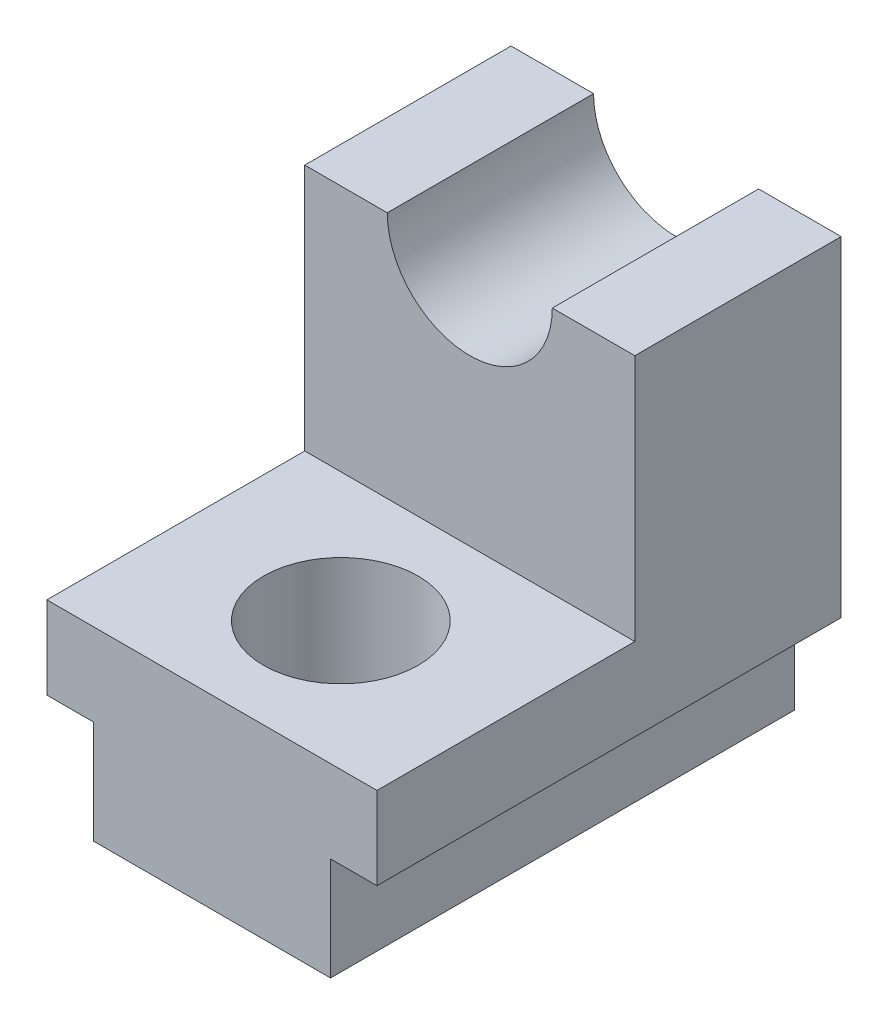
ISO-10303-21;
HEADER;
FILE_DESCRIPTION(('STEP AP214'),'2;1');
FILE_NAME('part.step','',(''),(''),'','','');
FILE_SCHEMA(('AUTOMOTIVE_DESIGN { 1 0 10303 214 1 1 1 1 }'));
ENDSEC;
DATA;
#1=APPLICATION_CONTEXT('core data for automotive mechanical design processes');
#2=APPLICATION_PROTOCOL_DEFINITION('international standard','automotive_design',2000,#1);
#3=PRODUCT_CONTEXT('',#1,'mechanical');
#4=PRODUCT('Part','Part','',(#3));
#5=PRODUCT_RELATED_PRODUCT_CATEGORY('part','',(#4));
#6=PRODUCT_DEFINITION_FORMATION('','',#4);
#7=PRODUCT_DEFINITION_CONTEXT('part definition',#1,'design');
#8=PRODUCT_DEFINITION('design','',#6,#7);
#9=PRODUCT_DEFINITION_SHAPE('','',#8);
#10=(LENGTH_UNIT() NAMED_UNIT(*) SI_UNIT(.MILLI.,.METRE.));
#11=(NAMED_UNIT(*) PLANE_ANGLE_UNIT() SI_UNIT($,.RADIAN.));
#12=(NAMED_UNIT(*) SI_UNIT($,.STERADIAN.) SOLID_ANGLE_UNIT());
#13=UNCERTAINTY_MEASURE_WITH_UNIT(LENGTH_MEASURE(1.E-05),#10,'distance_accuracy_value','');
#14=(GEOMETRIC_REPRESENTATION_CONTEXT(3) GLOBAL_UNCERTAINTY_ASSIGNED_CONTEXT((#13)) GLOBAL_UNIT_ASSIGNED_CONTEXT((#10,
#11,#12)) REPRESENTATION_CONTEXT('',''));
#15=CARTESIAN_POINT('',(0.,0.,0.));
#16=DIRECTION('',(0.,0.,1.));
#17=DIRECTION('',(1.,0.,0.));
#18=AXIS2_PLACEMENT_3D('',#15,#16,#17);
#19=CARTESIAN_POINT('',(0.,37.,0.));
#20=DIRECTION('',(0.,1.,0.));
#21=DIRECTION('',(0.,0.,1.));
#22=AXIS2_PLACEMENT_3D('',#19,#20,#21);
#23=PLANE('',#22);
#24=DIRECTION('',(0.,0.,1.));
#25=VECTOR('',#24,1.);
#26=CARTESIAN_POINT('',(-8.,37.,-49.));
#27=LINE('',#26,#25);
#28=CARTESIAN_POINT('',(-8.,37.,-45.));
#29=VERTEX_POINT('',#28);
#30=CARTESIAN_POINT('',(-8.,37.,-25.));
#31=VERTEX_POINT('',#30);
#32=EDGE_CURVE('E11',#29,#31,#27,.T.);
#33=ORIENTED_EDGE('',*,*,#32,.F.);
#34=DIRECTION('',(-1.,0.,0.));
#35=VECTOR('',#34,1.);
#36=CARTESIAN_POINT('',(-16.,37.,-45.));
#37=LINE('',#36,#35);
#38=CARTESIAN_POINT('',(-16.,37.,-45.));
#39=VERTEX_POINT('',#38);
#40=EDGE_CURVE('E157',#29,#39,#37,.T.);
#41=ORIENTED_EDGE('',*,*,#40,.T.);
#42=DIRECTION('',(0.,0.,1.));
#43=VECTOR('',#42,1.);
#44=CARTESIAN_POINT('',(-16.,37.,-45.));
#45=LINE('',#44,#43);
#46=CARTESIAN_POINT('',(-16.,37.,-25.));
#47=VERTEX_POINT('',#46);
#48=EDGE_CURVE('E149',#39,#47,#45,.T.);
#49=ORIENTED_EDGE('',*,*,#48,.T.);
#50=DIRECTION('',(1.,0.,0.));
#51=VECTOR('',#50,1.);
#52=CARTESIAN_POINT('',(-16.,37.,-25.));
#53=LINE('',#52,#51);
#54=EDGE_CURVE('E142',#47,#31,#53,.T.);
#55=ORIENTED_EDGE('',*,*,#54,.T.);
#56=EDGE_LOOP('',(#33,#41,#49,#55));
#57=FACE_BOUND('',#56,.T.);
#58=ADVANCED_FACE('F45',(#57),#23,.T.);
#59=CARTESIAN_POINT('',(11.5,5.,-45.));
#60=DIRECTION('',(0.,-1.,0.));
#61=DIRECTION('',(1.,0.,0.));
#62=AXIS2_PLACEMENT_3D('',#59,#60,#61);
#63=PLANE('',#62);
#64=DIRECTION('',(1.,0.,0.));
#65=VECTOR('',#64,1.);
#66=CARTESIAN_POINT('',(11.5,5.,0.));
#67=LINE('',#66,#65);
#68=CARTESIAN_POINT('',(11.5,5.,0.));
#69=VERTEX_POINT('',#68);
#70=CARTESIAN_POINT('',(16.,5.,0.));
#71=VERTEX_POINT('',#70);
#72=EDGE_CURVE('E183',#69,#71,#67,.T.);
#73=ORIENTED_EDGE('',*,*,#72,.F.);
#74=DIRECTION('',(0.,0.,1.));
#75=VECTOR('',#74,1.);
#76=CARTESIAN_POINT('',(11.5,5.,-45.));
#77=LINE('',#76,#75);
#78=CARTESIAN_POINT('',(11.5,5.,-45.));
#79=VERTEX_POINT('',#78);
#80=EDGE_CURVE('E243',#79,#69,#77,.T.);
#81=ORIENTED_EDGE('',*,*,#80,.F.);
#82=DIRECTION('',(1.,0.,0.));
#83=VECTOR('',#82,1.);
#84=CARTESIAN_POINT('',(11.5,5.,-45.));
#85=LINE('',#84,#83);
#86=CARTESIAN_POINT('',(16.,5.,-45.));
#87=VERTEX_POINT('',#86);
#88=EDGE_CURVE('E184',#79,#87,#85,.T.);
#89=ORIENTED_EDGE('',*,*,#88,.T.);
#90=DIRECTION('',(0.,0.,1.));
#91=VECTOR('',#90,1.);
#92=CARTESIAN_POINT('',(16.,5.,-45.));
#93=LINE('',#92,#91);
#94=EDGE_CURVE('E212',#87,#71,#93,.T.);
#95=ORIENTED_EDGE('',*,*,#94,.T.);
#96=EDGE_LOOP('',(#73,#81,#89,#95));
#97=FACE_BOUND('',#96,.T.);
#98=ADVANCED_FACE('F47',(#97),#63,.T.);
#99=CARTESIAN_POINT('',(11.5,-5.,-45.));
#100=DIRECTION('',(1.,0.,0.));
#101=DIRECTION('',(0.,1.,0.));
#102=AXIS2_PLACEMENT_3D('',#99,#100,#101);
#103=PLANE('',#102);
#104=DIRECTION('',(0.,1.,0.));
#105=VECTOR('',#104,1.);
#106=CARTESIAN_POINT('',(11.5,-5.,0.));
#107=LINE('',#106,#105);
#108=CARTESIAN_POINT('',(11.5,-5.,0.));
#109=VERTEX_POINT('',#108);
#110=EDGE_CURVE('E189',#109,#69,#107,.T.);
#111=ORIENTED_EDGE('',*,*,#110,.F.);
#112=DIRECTION('',(0.,0.,1.));
#113=VECTOR('',#112,1.);
#114=CARTESIAN_POINT('',(11.5,-5.,-45.));
#115=LINE('',#114,#113);
#116=CARTESIAN_POINT('',(11.5,-5.,-45.));
#117=VERTEX_POINT('',#116);
#118=EDGE_CURVE('E246',#117,#109,#115,.T.);
#119=ORIENTED_EDGE('',*,*,#118,.F.);
#120=DIRECTION('',(0.,1.,0.));
#121=VECTOR('',#120,1.);
#122=CARTESIAN_POINT('',(11.5,-5.,-45.));
#123=LINE('',#122,#121);
#124=EDGE_CURVE('E208',#117,#79,#123,.T.);
#125=ORIENTED_EDGE('',*,*,#124,.T.);
#126=ORIENTED_EDGE('',*,*,#80,.T.);
#127=EDGE_LOOP('',(#111,#119,#125,#126));
#128=FACE_BOUND('',#127,.T.);
#129=ADVANCED_FACE('F284',(#128),#103,.T.);
#130=CARTESIAN_POINT('',(-11.5,-5.,-45.));
#131=DIRECTION('',(0.,-1.,0.));
#132=DIRECTION('',(1.,0.,0.));
#133=AXIS2_PLACEMENT_3D('',#130,#131,#132);
#134=PLANE('',#133);
#135=CARTESIAN_POINT('',(0.,-5.,-12.5));
#136=DIRECTION('',(0.,-1.,0.));
#137=DIRECTION('',(1.,0.,0.));
#138=AXIS2_PLACEMENT_3D('',#135,#136,#137);
#139=CIRCLE('',#138,7.5);
#140=CARTESIAN_POINT('',(7.5,-5.,-12.5));
#141=VERTEX_POINT('',#140);
#142=EDGE_CURVE('E179',#141,#141,#139,.T.);
#143=ORIENTED_EDGE('',*,*,#142,.F.);
#144=EDGE_LOOP('',(#143));
#145=FACE_BOUND('',#144,.T.);
#146=DIRECTION('',(1.,0.,0.));
#147=VECTOR('',#146,1.);
#148=CARTESIAN_POINT('',(-11.5,-5.,0.));
#149=LINE('',#148,#147);
#150=CARTESIAN_POINT('',(-11.5,-5.,0.));
#151=VERTEX_POINT('',#150);
#152=EDGE_CURVE('E236',#151,#109,#149,.T.);
#153=ORIENTED_EDGE('',*,*,#152,.F.);
#154=DIRECTION('',(0.,0.,1.));
#155=VECTOR('',#154,1.);
#156=CARTESIAN_POINT('',(-11.5,-5.,-45.));
#157=LINE('',#156,#155);
#158=CARTESIAN_POINT('',(-11.5,-5.,-45.));
#159=VERTEX_POINT('',#158);
#160=EDGE_CURVE('E249',#159,#151,#157,.T.);
#161=ORIENTED_EDGE('',*,*,#160,.F.);
#162=DIRECTION('',(1.,0.,0.));
#163=VECTOR('',#162,1.);
#164=CARTESIAN_POINT('',(-11.5,-5.,-45.));
#165=LINE('',#164,#163);
#166=EDGE_CURVE('E204',#159,#117,#165,.T.);
#167=ORIENTED_EDGE('',*,*,#166,.T.);
#168=ORIENTED_EDGE('',*,*,#118,.T.);
#169=EDGE_LOOP('',(#153,#161,#167,#168));
#170=FACE_BOUND('',#169,.T.);
#171=ADVANCED_FACE('F305',(#145,#170),#134,.T.);
#172=CARTESIAN_POINT('',(-11.5,-5.,-45.));
#173=DIRECTION('',(-1.,0.,0.));
#174=DIRECTION('',(0.,-1.,0.));
#175=AXIS2_PLACEMENT_3D('',#172,#173,#174);
#176=PLANE('',#175);
#177=DIRECTION('',(0.,-1.,0.));
#178=VECTOR('',#177,1.);
#179=CARTESIAN_POINT('',(-11.5,-5.,0.));
#180=LINE('',#179,#178);
#181=CARTESIAN_POINT('',(-11.5,5.,0.));
#182=VERTEX_POINT('',#181);
#183=EDGE_CURVE('E232',#182,#151,#180,.T.);
#184=ORIENTED_EDGE('',*,*,#183,.F.);
#185=DIRECTION('',(0.,0.,1.));
#186=VECTOR('',#185,1.);
#187=CARTESIAN_POINT('',(-11.5,5.,-45.));
#188=LINE('',#187,#186);
#189=CARTESIAN_POINT('',(-11.5,5.,-45.));
#190=VERTEX_POINT('',#189);
#191=EDGE_CURVE('E252',#190,#182,#188,.T.);
#192=ORIENTED_EDGE('',*,*,#191,.F.);
#193=DIRECTION('',(0.,-1.,0.));
#194=VECTOR('',#193,1.);
#195=CARTESIAN_POINT('',(-11.5,-5.,-45.));
#196=LINE('',#195,#194);
#197=EDGE_CURVE('E200',#190,#159,#196,.T.);
#198=ORIENTED_EDGE('',*,*,#197,.T.);
#199=ORIENTED_EDGE('',*,*,#160,.T.);
#200=EDGE_LOOP('',(#184,#192,#198,#199));
#201=FACE_BOUND('',#200,.T.);
#202=ADVANCED_FACE('F291',(#201),#176,.T.);
#203=CARTESIAN_POINT('',(-11.5,5.,-45.));
#204=DIRECTION('',(0.,-1.,0.));
#205=DIRECTION('',(1.,0.,0.));
#206=AXIS2_PLACEMENT_3D('',#203,#204,#205);
#207=PLANE('',#206);
#208=DIRECTION('',(1.,0.,0.));
#209=VECTOR('',#208,1.);
#210=CARTESIAN_POINT('',(-11.5,5.,0.));
#211=LINE('',#210,#209);
#212=CARTESIAN_POINT('',(-16.,5.,0.));
#213=VERTEX_POINT('',#212);
#214=EDGE_CURVE('E228',#213,#182,#211,.T.);
#215=ORIENTED_EDGE('',*,*,#214,.F.);
#216=DIRECTION('',(0.,0.,1.));
#217=VECTOR('',#216,1.);
#218=CARTESIAN_POINT('',(-16.,5.,-45.));
#219=LINE('',#218,#217);
#220=CARTESIAN_POINT('',(-16.,5.,-45.));
#221=VERTEX_POINT('',#220);
#222=EDGE_CURVE('E255',#221,#213,#219,.T.);
#223=ORIENTED_EDGE('',*,*,#222,.F.);
#224=DIRECTION('',(1.,0.,0.));
#225=VECTOR('',#224,1.);
#226=CARTESIAN_POINT('',(-11.5,5.,-45.));
#227=LINE('',#226,#225);
#228=EDGE_CURVE('E196',#221,#190,#227,.T.);
#229=ORIENTED_EDGE('',*,*,#228,.T.);
#230=ORIENTED_EDGE('',*,*,#191,.T.);
#231=EDGE_LOOP('',(#215,#223,#229,#230));
#232=FACE_BOUND('',#231,.T.);
#233=ADVANCED_FACE('F295',(#232),#207,.T.);
#234=CARTESIAN_POINT('',(-16.,5.,-45.));
#235=DIRECTION('',(-1.,0.,0.));
#236=DIRECTION('',(0.,0.,1.));
#237=AXIS2_PLACEMENT_3D('',#234,#235,#236);
#238=PLANE('',#237);
#239=DIRECTION('',(0.,-1.,0.));
#240=VECTOR('',#239,1.);
#241=CARTESIAN_POINT('',(-16.,5.,0.));
#242=LINE('',#241,#240);
#243=CARTESIAN_POINT('',(-16.,13.,0.));
#244=VERTEX_POINT('',#243);
#245=EDGE_CURVE('E224',#244,#213,#242,.T.);
#246=ORIENTED_EDGE('',*,*,#245,.F.);
#247=DIRECTION('',(0.,0.,1.));
#248=VECTOR('',#247,1.);
#249=CARTESIAN_POINT('',(-16.,13.,-45.));
#250=LINE('',#249,#248);
#251=CARTESIAN_POINT('',(-16.,13.,-25.));
#252=VERTEX_POINT('',#251);
#253=EDGE_CURVE('E258',#252,#244,#250,.T.);
#254=ORIENTED_EDGE('',*,*,#253,.F.);
#255=DIRECTION('',(0.,-1.,0.));
#256=VECTOR('',#255,1.);
#257=CARTESIAN_POINT('',(-16.,37.,-25.));
#258=LINE('',#257,#256);
#259=EDGE_CURVE('E172',#47,#252,#258,.T.);
#260=ORIENTED_EDGE('',*,*,#259,.F.);
#261=ORIENTED_EDGE('',*,*,#48,.F.);
#262=DIRECTION('',(0.,-1.,0.));
#263=VECTOR('',#262,1.);
#264=CARTESIAN_POINT('',(-16.,5.,-45.));
#265=LINE('',#264,#263);
#266=EDGE_CURVE('E192',#39,#221,#265,.T.);
#267=ORIENTED_EDGE('',*,*,#266,.T.);
#268=ORIENTED_EDGE('',*,*,#222,.T.);
#269=EDGE_LOOP('',(#246,#254,#260,#261,#267,#268));
#270=FACE_BOUND('',#269,.T.);
#271=ADVANCED_FACE('F298',(#270),#238,.T.);
#272=CARTESIAN_POINT('',(16.,13.,-45.));
#273=DIRECTION('',(0.,1.,0.));
#274=DIRECTION('',(0.,0.,1.));
#275=AXIS2_PLACEMENT_3D('',#272,#273,#274);
#276=PLANE('',#275);
#277=DIRECTION('',(1.,0.,0.));
#278=VECTOR('',#277,1.);
#279=CARTESIAN_POINT('',(-16.,13.,-25.));
#280=LINE('',#279,#278);
#281=CARTESIAN_POINT('',(16.,13.,-25.));
#282=VERTEX_POINT('',#281);
#283=EDGE_CURVE('E68',#252,#282,#280,.T.);
#284=ORIENTED_EDGE('',*,*,#283,.F.);
#285=ORIENTED_EDGE('',*,*,#253,.T.);
#286=DIRECTION('',(-1.,0.,0.));
#287=VECTOR('',#286,1.);
#288=CARTESIAN_POINT('',(16.,13.,0.));
#289=LINE('',#288,#287);
#290=CARTESIAN_POINT('',(16.,13.,0.));
#291=VERTEX_POINT('',#290);
#292=EDGE_CURVE('E220',#291,#244,#289,.T.);
#293=ORIENTED_EDGE('',*,*,#292,.F.);
#294=DIRECTION('',(0.,0.,1.));
#295=VECTOR('',#294,1.);
#296=CARTESIAN_POINT('',(16.,13.,-45.));
#297=LINE('',#296,#295);
#298=EDGE_CURVE('E261',#282,#291,#297,.T.);
#299=ORIENTED_EDGE('',*,*,#298,.F.);
#300=EDGE_LOOP('',(#284,#285,#293,#299));
#301=FACE_BOUND('',#300,.T.);
#302=CARTESIAN_POINT('',(0.,13.,-12.5));
#303=DIRECTION('',(0.,1.,0.));
#304=DIRECTION('',(0.,0.,1.));
#305=AXIS2_PLACEMENT_3D('',#302,#303,#304);
#306=CIRCLE('',#305,7.5);
#307=CARTESIAN_POINT('',(0.,13.,-5.));
#308=VERTEX_POINT('',#307);
#309=EDGE_CURVE('E175',#308,#308,#306,.T.);
#310=ORIENTED_EDGE('',*,*,#309,.F.);
#311=EDGE_LOOP('',(#310));
#312=FACE_BOUND('',#311,.T.);
#313=ADVANCED_FACE('F301',(#301,#312),#276,.T.);
#314=CARTESIAN_POINT('',(16.,5.,-45.));
#315=DIRECTION('',(1.,0.,0.));
#316=DIRECTION('',(0.,0.,-1.));
#317=AXIS2_PLACEMENT_3D('',#314,#315,#316);
#318=PLANE('',#317);
#319=DIRECTION('',(0.,1.,0.));
#320=VECTOR('',#319,1.);
#321=CARTESIAN_POINT('',(16.,5.,0.));
#322=LINE('',#321,#320);
#323=EDGE_CURVE('E216',#71,#291,#322,.T.);
#324=ORIENTED_EDGE('',*,*,#323,.F.);
#325=ORIENTED_EDGE('',*,*,#94,.F.);
#326=DIRECTION('',(0.,1.,0.));
#327=VECTOR('',#326,1.);
#328=CARTESIAN_POINT('',(16.,5.,-45.));
#329=LINE('',#328,#327);
#330=CARTESIAN_POINT('',(16.,37.,-45.));
#331=VERTEX_POINT('',#330);
#332=EDGE_CURVE('E188',#87,#331,#329,.T.);
#333=ORIENTED_EDGE('',*,*,#332,.T.);
#334=DIRECTION('',(0.,0.,-1.));
#335=VECTOR('',#334,1.);
#336=CARTESIAN_POINT('',(16.,37.,-45.));
#337=LINE('',#336,#335);
#338=CARTESIAN_POINT('',(16.,37.,-25.));
#339=VERTEX_POINT('',#338);
#340=EDGE_CURVE('E152',#339,#331,#337,.T.);
#341=ORIENTED_EDGE('',*,*,#340,.F.);
#342=DIRECTION('',(0.,-1.,0.));
#343=VECTOR('',#342,1.);
#344=CARTESIAN_POINT('',(16.,37.,-25.));
#345=LINE('',#344,#343);
#346=EDGE_CURVE('E166',#339,#282,#345,.T.);
#347=ORIENTED_EDGE('',*,*,#346,.T.);
#348=ORIENTED_EDGE('',*,*,#298,.T.);
#349=EDGE_LOOP('',(#324,#325,#333,#341,#347,#348));
#350=FACE_BOUND('',#349,.T.);
#351=ADVANCED_FACE('F277',(#350),#318,.T.);
#352=CARTESIAN_POINT('',(0.,0.,-45.));
#353=DIRECTION('',(0.,0.,1.));
#354=DIRECTION('',(1.,0.,0.));
#355=AXIS2_PLACEMENT_3D('',#352,#353,#354);
#356=PLANE('',#355);
#357=ORIENTED_EDGE('',*,*,#40,.F.);
#358=CARTESIAN_POINT('',(0.,37.,-45.));
#359=DIRECTION('',(0.,0.,1.));
#360=DIRECTION('',(1.,0.,0.));
#361=AXIS2_PLACEMENT_3D('',#358,#359,#360);
#362=CIRCLE('',#361,8.);
#363=CARTESIAN_POINT('',(8.,37.,-45.));
#364=VERTEX_POINT('',#363);
#365=EDGE_CURVE('E134',#29,#364,#362,.T.);
#366=ORIENTED_EDGE('',*,*,#365,.T.);
#367=EDGE_CURVE('E162',#331,#364,#37,.T.);
#368=ORIENTED_EDGE('',*,*,#367,.F.);
#369=ORIENTED_EDGE('',*,*,#332,.F.);
#370=ORIENTED_EDGE('',*,*,#88,.F.);
#371=ORIENTED_EDGE('',*,*,#124,.F.);
#372=ORIENTED_EDGE('',*,*,#166,.F.);
#373=ORIENTED_EDGE('',*,*,#197,.F.);
#374=ORIENTED_EDGE('',*,*,#228,.F.);
#375=ORIENTED_EDGE('',*,*,#266,.F.);
#376=EDGE_LOOP('',(#357,#366,#368,#369,#370,#371,#372,#373,#374,#375));
#377=FACE_BOUND('',#376,.T.);
#378=ADVANCED_FACE('F269',(#377),#356,.F.);
#379=CARTESIAN_POINT('',(0.,0.,0.));
#380=DIRECTION('',(0.,0.,1.));
#381=DIRECTION('',(1.,0.,0.));
#382=AXIS2_PLACEMENT_3D('',#379,#380,#381);
#383=PLANE('',#382);
#384=ORIENTED_EDGE('',*,*,#72,.T.);
#385=ORIENTED_EDGE('',*,*,#323,.T.);
#386=ORIENTED_EDGE('',*,*,#292,.T.);
#387=ORIENTED_EDGE('',*,*,#245,.T.);
#388=ORIENTED_EDGE('',*,*,#214,.T.);
#389=ORIENTED_EDGE('',*,*,#183,.T.);
#390=ORIENTED_EDGE('',*,*,#152,.T.);
#391=ORIENTED_EDGE('',*,*,#110,.T.);
#392=EDGE_LOOP('',(#384,#385,#386,#387,#388,#389,#390,#391));
#393=FACE_BOUND('',#392,.T.);
#394=ADVANCED_FACE('F304',(#393),#383,.T.);
#395=CARTESIAN_POINT('',(0.,-11.,-12.5));
#396=DIRECTION('',(0.,1.,0.));
#397=DIRECTION('',(0.,0.,1.));
#398=AXIS2_PLACEMENT_3D('',#395,#396,#397);
#399=CYLINDRICAL_SURFACE('',#398,7.5);
#400=ORIENTED_EDGE('',*,*,#142,.T.);
#401=EDGE_LOOP('',(#400));
#402=FACE_BOUND('',#401,.T.);
#403=ORIENTED_EDGE('',*,*,#309,.T.);
#404=EDGE_LOOP('',(#403));
#405=FACE_BOUND('',#404,.T.);
#406=ADVANCED_FACE('F332',(#402,#405),#399,.F.);
#407=CARTESIAN_POINT('',(-16.,37.,-25.));
#408=DIRECTION('',(0.,0.,-1.));
#409=DIRECTION('',(-1.,0.,0.));
#410=AXIS2_PLACEMENT_3D('',#407,#408,#409);
#411=PLANE('',#410);
#412=CARTESIAN_POINT('',(8.,37.,-25.));
#413=VERTEX_POINT('',#412);
#414=EDGE_CURVE('E145',#413,#339,#53,.T.);
#415=ORIENTED_EDGE('',*,*,#414,.F.);
#416=CARTESIAN_POINT('',(0.,37.,-25.));
#417=DIRECTION('',(0.,0.,1.));
#418=DIRECTION('',(1.,0.,0.));
#419=AXIS2_PLACEMENT_3D('',#416,#417,#418);
#420=CIRCLE('',#419,8.);
#421=EDGE_CURVE('E60',#31,#413,#420,.T.);
#422=ORIENTED_EDGE('',*,*,#421,.F.);
#423=ORIENTED_EDGE('',*,*,#54,.F.);
#424=ORIENTED_EDGE('',*,*,#259,.T.);
#425=ORIENTED_EDGE('',*,*,#283,.T.);
#426=ORIENTED_EDGE('',*,*,#346,.F.);
#427=EDGE_LOOP('',(#415,#422,#423,#424,#425,#426));
#428=FACE_BOUND('',#427,.T.);
#429=ADVANCED_FACE('F140',(#428),#411,.F.);
#430=DIRECTION('',(0.,0.,1.));
#431=VECTOR('',#430,1.);
#432=CARTESIAN_POINT('',(8.,37.,-49.));
#433=LINE('',#432,#431);
#434=EDGE_CURVE('E54',#413,#364,#433,.F.);
#435=ORIENTED_EDGE('',*,*,#434,.F.);
#436=ORIENTED_EDGE('',*,*,#414,.T.);
#437=ORIENTED_EDGE('',*,*,#340,.T.);
#438=ORIENTED_EDGE('',*,*,#367,.T.);
#439=EDGE_LOOP('',(#435,#436,#437,#438));
#440=FACE_BOUND('',#439,.T.);
#441=ADVANCED_FACE('F273',(#440),#23,.T.);
#442=CARTESIAN_POINT('',(0.,37.,-49.));
#443=DIRECTION('',(0.,0.,1.));
#444=DIRECTION('',(1.,0.,0.));
#445=AXIS2_PLACEMENT_3D('',#442,#443,#444);
#446=CYLINDRICAL_SURFACE('',#445,8.);
#447=ORIENTED_EDGE('',*,*,#32,.T.);
#448=ORIENTED_EDGE('',*,*,#421,.T.);
#449=ORIENTED_EDGE('',*,*,#434,.T.);
#450=ORIENTED_EDGE('',*,*,#365,.F.);
#451=EDGE_LOOP('',(#447,#448,#449,#450));
#452=FACE_BOUND('',#451,.T.);
#453=ADVANCED_FACE('F132',(#452),#446,.F.);
#454=CLOSED_SHELL('',(#58,#98,#129,#171,#202,#233,#271,#313,#351,#378,#394,#406,#429,#441,#453));
#455=MANIFOLD_SOLID_BREP('B2',#454);
#456=ADVANCED_BREP_SHAPE_REPRESENTATION('',(#18,#455),#14);
#457=SHAPE_DEFINITION_REPRESENTATION(#9,#456);
ENDSEC;
END-ISO-10303-21;
